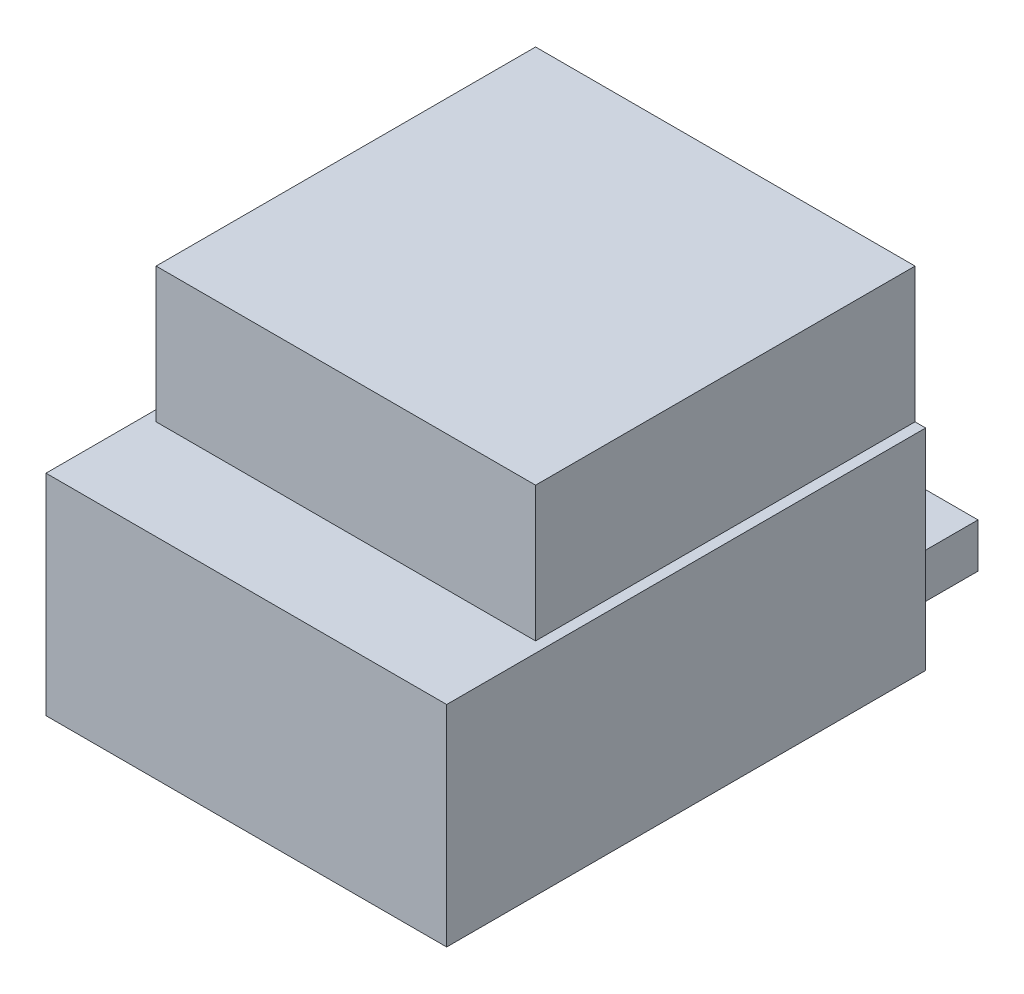
ISO-10303-21;
HEADER;
FILE_DESCRIPTION(('STEP AP214'),'2;1');
FILE_NAME('part.step','',(''),(''),'','','');
FILE_SCHEMA(('AUTOMOTIVE_DESIGN { 1 0 10303 214 1 1 1 1 }'));
ENDSEC;
DATA;
#1=APPLICATION_CONTEXT('core data for automotive mechanical design processes');
#2=APPLICATION_PROTOCOL_DEFINITION('international standard','automotive_design',2000,#1);
#3=PRODUCT_CONTEXT('',#1,'mechanical');
#4=PRODUCT('Part','Part','',(#3));
#5=PRODUCT_RELATED_PRODUCT_CATEGORY('part','',(#4));
#6=PRODUCT_DEFINITION_FORMATION('','',#4);
#7=PRODUCT_DEFINITION_CONTEXT('part definition',#1,'design');
#8=PRODUCT_DEFINITION('design','',#6,#7);
#9=PRODUCT_DEFINITION_SHAPE('','',#8);
#10=(LENGTH_UNIT() NAMED_UNIT(*) SI_UNIT(.MILLI.,.METRE.));
#11=(NAMED_UNIT(*) PLANE_ANGLE_UNIT() SI_UNIT($,.RADIAN.));
#12=(NAMED_UNIT(*) SI_UNIT($,.STERADIAN.) SOLID_ANGLE_UNIT());
#13=UNCERTAINTY_MEASURE_WITH_UNIT(LENGTH_MEASURE(1.E-05),#10,'distance_accuracy_value','');
#14=(GEOMETRIC_REPRESENTATION_CONTEXT(3) GLOBAL_UNCERTAINTY_ASSIGNED_CONTEXT((#13)) GLOBAL_UNIT_ASSIGNED_CONTEXT((#10,
#11,#12)) REPRESENTATION_CONTEXT('',''));
#15=CARTESIAN_POINT('',(0.,0.,0.));
#16=DIRECTION('',(0.,0.,1.));
#17=DIRECTION('',(1.,0.,0.));
#18=AXIS2_PLACEMENT_3D('',#15,#16,#17);
#19=CARTESIAN_POINT('',(-15.785,16.55,-18.87));
#20=DIRECTION('',(0.,0.,1.));
#21=DIRECTION('',(1.,0.,0.));
#22=AXIS2_PLACEMENT_3D('',#19,#20,#21);
#23=PLANE('',#22);
#24=DIRECTION('',(-1.,0.,0.));
#25=VECTOR('',#24,1.);
#26=CARTESIAN_POINT('',(-15.785,0.,-18.87));
#27=LINE('',#26,#25);
#28=CARTESIAN_POINT('',(15.785,0.,-18.87));
#29=VERTEX_POINT('',#28);
#30=CARTESIAN_POINT('',(-15.785,0.,-18.87));
#31=VERTEX_POINT('',#30);
#32=EDGE_CURVE('E222',#29,#31,#27,.T.);
#33=ORIENTED_EDGE('',*,*,#32,.T.);
#34=DIRECTION('',(0.,-1.,0.));
#35=VECTOR('',#34,1.);
#36=CARTESIAN_POINT('',(-15.785,16.55,-18.87));
#37=LINE('',#36,#35);
#38=CARTESIAN_POINT('',(-15.785,16.55,-18.87));
#39=VERTEX_POINT('',#38);
#40=EDGE_CURVE('E46',#39,#31,#37,.T.);
#41=ORIENTED_EDGE('',*,*,#40,.F.);
#42=DIRECTION('',(-1.,0.,0.));
#43=VECTOR('',#42,1.);
#44=CARTESIAN_POINT('',(-15.785,16.55,-18.87));
#45=LINE('',#44,#43);
#46=CARTESIAN_POINT('',(-14.95,16.55,-18.87));
#47=VERTEX_POINT('',#46);
#48=EDGE_CURVE('E205',#47,#39,#45,.T.);
#49=ORIENTED_EDGE('',*,*,#48,.F.);
#50=DIRECTION('',(0.,-1.,0.));
#51=VECTOR('',#50,1.);
#52=CARTESIAN_POINT('',(-14.95,27.18,-18.87));
#53=LINE('',#52,#51);
#54=CARTESIAN_POINT('',(-14.95,27.18,-18.87));
#55=VERTEX_POINT('',#54);
#56=EDGE_CURVE('E178',#55,#47,#53,.T.);
#57=ORIENTED_EDGE('',*,*,#56,.F.);
#58=DIRECTION('',(-1.,0.,0.));
#59=VECTOR('',#58,1.);
#60=CARTESIAN_POINT('',(14.95,27.18,-18.87));
#61=LINE('',#60,#59);
#62=CARTESIAN_POINT('',(14.95,27.18,-18.87));
#63=VERTEX_POINT('',#62);
#64=EDGE_CURVE('E176',#63,#55,#61,.T.);
#65=ORIENTED_EDGE('',*,*,#64,.F.);
#66=DIRECTION('',(0.,-1.,0.));
#67=VECTOR('',#66,1.);
#68=CARTESIAN_POINT('',(14.95,27.18,-18.87));
#69=LINE('',#68,#67);
#70=CARTESIAN_POINT('',(14.95,16.55,-18.87));
#71=VERTEX_POINT('',#70);
#72=EDGE_CURVE('E189',#63,#71,#69,.T.);
#73=ORIENTED_EDGE('',*,*,#72,.T.);
#74=CARTESIAN_POINT('',(15.785,16.55,-18.87));
#75=VERTEX_POINT('',#74);
#76=EDGE_CURVE('E208',#75,#71,#45,.T.);
#77=ORIENTED_EDGE('',*,*,#76,.F.);
#78=DIRECTION('',(0.,-1.,0.));
#79=VECTOR('',#78,1.);
#80=CARTESIAN_POINT('',(15.785,16.55,-18.87));
#81=LINE('',#80,#79);
#82=EDGE_CURVE('E11',#75,#29,#81,.T.);
#83=ORIENTED_EDGE('',*,*,#82,.T.);
#84=EDGE_LOOP('',(#33,#41,#49,#57,#65,#73,#77,#83));
#85=FACE_BOUND('',#84,.T.);
#86=DIRECTION('',(-1.,0.,0.));
#87=VECTOR('',#86,1.);
#88=CARTESIAN_POINT('',(13.07,5.5,-18.87));
#89=LINE('',#88,#87);
#90=CARTESIAN_POINT('',(13.07,5.5,-18.87));
#91=VERTEX_POINT('',#90);
#92=CARTESIAN_POINT('',(-13.07,5.5,-18.87));
#93=VERTEX_POINT('',#92);
#94=EDGE_CURVE('E139',#91,#93,#89,.T.);
#95=ORIENTED_EDGE('',*,*,#94,.T.);
#96=DIRECTION('',(0.,-1.,0.));
#97=VECTOR('',#96,1.);
#98=CARTESIAN_POINT('',(-13.07,5.5,-18.87));
#99=LINE('',#98,#97);
#100=CARTESIAN_POINT('',(-13.07,2.,-18.87));
#101=VERTEX_POINT('',#100);
#102=EDGE_CURVE('E152',#93,#101,#99,.T.);
#103=ORIENTED_EDGE('',*,*,#102,.T.);
#104=DIRECTION('',(-1.,0.,0.));
#105=VECTOR('',#104,1.);
#106=CARTESIAN_POINT('',(13.07,2.,-18.87));
#107=LINE('',#106,#105);
#108=CARTESIAN_POINT('',(13.07,2.,-18.87));
#109=VERTEX_POINT('',#108);
#110=EDGE_CURVE('E153',#109,#101,#107,.T.);
#111=ORIENTED_EDGE('',*,*,#110,.F.);
#112=DIRECTION('',(0.,-1.,0.));
#113=VECTOR('',#112,1.);
#114=CARTESIAN_POINT('',(13.07,5.5,-18.87));
#115=LINE('',#114,#113);
#116=EDGE_CURVE('E165',#91,#109,#115,.T.);
#117=ORIENTED_EDGE('',*,*,#116,.F.);
#118=EDGE_LOOP('',(#95,#103,#111,#117));
#119=FACE_BOUND('',#118,.T.);
#120=ADVANCED_FACE('F37',(#85,#119),#23,.F.);
#121=CARTESIAN_POINT('',(0.,16.55,0.));
#122=DIRECTION('',(0.,-1.,0.));
#123=DIRECTION('',(0.,0.,-1.));
#124=AXIS2_PLACEMENT_3D('',#121,#122,#123);
#125=PLANE('',#124);
#126=DIRECTION('',(0.,0.,1.));
#127=VECTOR('',#126,1.);
#128=CARTESIAN_POINT('',(-14.95,16.55,11.03));
#129=LINE('',#128,#127);
#130=CARTESIAN_POINT('',(-14.95,16.55,11.03));
#131=VERTEX_POINT('',#130);
#132=EDGE_CURVE('E164',#47,#131,#129,.T.);
#133=ORIENTED_EDGE('',*,*,#132,.F.);
#134=ORIENTED_EDGE('',*,*,#48,.T.);
#135=DIRECTION('',(0.,0.,1.));
#136=VECTOR('',#135,1.);
#137=CARTESIAN_POINT('',(-15.785,16.55,18.87));
#138=LINE('',#137,#136);
#139=CARTESIAN_POINT('',(-15.785,16.55,18.87));
#140=VERTEX_POINT('',#139);
#141=EDGE_CURVE('E213',#39,#140,#138,.T.);
#142=ORIENTED_EDGE('',*,*,#141,.T.);
#143=DIRECTION('',(1.,0.,0.));
#144=VECTOR('',#143,1.);
#145=CARTESIAN_POINT('',(-15.785,16.55,18.87));
#146=LINE('',#145,#144);
#147=CARTESIAN_POINT('',(15.785,16.55,18.87));
#148=VERTEX_POINT('',#147);
#149=EDGE_CURVE('E216',#140,#148,#146,.T.);
#150=ORIENTED_EDGE('',*,*,#149,.T.);
#151=DIRECTION('',(0.,0.,-1.));
#152=VECTOR('',#151,1.);
#153=CARTESIAN_POINT('',(15.785,16.55,18.87));
#154=LINE('',#153,#152);
#155=EDGE_CURVE('E209',#148,#75,#154,.T.);
#156=ORIENTED_EDGE('',*,*,#155,.T.);
#157=ORIENTED_EDGE('',*,*,#76,.T.);
#158=DIRECTION('',(0.,0.,-1.));
#159=VECTOR('',#158,1.);
#160=CARTESIAN_POINT('',(14.95,16.55,11.03));
#161=LINE('',#160,#159);
#162=CARTESIAN_POINT('',(14.95,16.55,11.03));
#163=VERTEX_POINT('',#162);
#164=EDGE_CURVE('E172',#163,#71,#161,.T.);
#165=ORIENTED_EDGE('',*,*,#164,.F.);
#166=DIRECTION('',(1.,0.,0.));
#167=VECTOR('',#166,1.);
#168=CARTESIAN_POINT('',(14.95,16.55,11.03));
#169=LINE('',#168,#167);
#170=EDGE_CURVE('E62',#131,#163,#169,.T.);
#171=ORIENTED_EDGE('',*,*,#170,.F.);
#172=EDGE_LOOP('',(#133,#134,#142,#150,#156,#157,#165,#171));
#173=FACE_BOUND('',#172,.T.);
#174=ADVANCED_FACE('F253',(#173),#125,.F.);
#175=CARTESIAN_POINT('',(15.785,16.55,18.87));
#176=DIRECTION('',(-1.,0.,0.));
#177=DIRECTION('',(0.,0.,1.));
#178=AXIS2_PLACEMENT_3D('',#175,#176,#177);
#179=PLANE('',#178);
#180=DIRECTION('',(0.,0.,-1.));
#181=VECTOR('',#180,1.);
#182=CARTESIAN_POINT('',(15.785,0.,18.87));
#183=LINE('',#182,#181);
#184=CARTESIAN_POINT('',(15.785,0.,18.87));
#185=VERTEX_POINT('',#184);
#186=EDGE_CURVE('E219',#185,#29,#183,.T.);
#187=ORIENTED_EDGE('',*,*,#186,.T.);
#188=ORIENTED_EDGE('',*,*,#82,.F.);
#189=ORIENTED_EDGE('',*,*,#155,.F.);
#190=DIRECTION('',(0.,-1.,0.));
#191=VECTOR('',#190,1.);
#192=CARTESIAN_POINT('',(15.785,16.55,18.87));
#193=LINE('',#192,#191);
#194=EDGE_CURVE('E218',#148,#185,#193,.T.);
#195=ORIENTED_EDGE('',*,*,#194,.T.);
#196=EDGE_LOOP('',(#187,#188,#189,#195));
#197=FACE_BOUND('',#196,.T.);
#198=ADVANCED_FACE('F39',(#197),#179,.F.);
#199=CARTESIAN_POINT('',(-15.785,16.55,18.87));
#200=DIRECTION('',(1.,0.,0.));
#201=DIRECTION('',(0.,0.,-1.));
#202=AXIS2_PLACEMENT_3D('',#199,#200,#201);
#203=PLANE('',#202);
#204=DIRECTION('',(0.,0.,1.));
#205=VECTOR('',#204,1.);
#206=CARTESIAN_POINT('',(-15.785,0.,18.87));
#207=LINE('',#206,#205);
#208=CARTESIAN_POINT('',(-15.785,0.,18.87));
#209=VERTEX_POINT('',#208);
#210=EDGE_CURVE('E224',#31,#209,#207,.T.);
#211=ORIENTED_EDGE('',*,*,#210,.T.);
#212=DIRECTION('',(0.,-1.,0.));
#213=VECTOR('',#212,1.);
#214=CARTESIAN_POINT('',(-15.785,16.55,18.87));
#215=LINE('',#214,#213);
#216=EDGE_CURVE('E230',#140,#209,#215,.T.);
#217=ORIENTED_EDGE('',*,*,#216,.F.);
#218=ORIENTED_EDGE('',*,*,#141,.F.);
#219=ORIENTED_EDGE('',*,*,#40,.T.);
#220=EDGE_LOOP('',(#211,#217,#218,#219));
#221=FACE_BOUND('',#220,.T.);
#222=ADVANCED_FACE('F238',(#221),#203,.F.);
#223=CARTESIAN_POINT('',(-15.785,16.55,18.87));
#224=DIRECTION('',(0.,0.,-1.));
#225=DIRECTION('',(-1.,0.,0.));
#226=AXIS2_PLACEMENT_3D('',#223,#224,#225);
#227=PLANE('',#226);
#228=DIRECTION('',(1.,0.,0.));
#229=VECTOR('',#228,1.);
#230=CARTESIAN_POINT('',(-15.785,0.,18.87));
#231=LINE('',#230,#229);
#232=EDGE_CURVE('E226',#209,#185,#231,.T.);
#233=ORIENTED_EDGE('',*,*,#232,.T.);
#234=ORIENTED_EDGE('',*,*,#194,.F.);
#235=ORIENTED_EDGE('',*,*,#149,.F.);
#236=ORIENTED_EDGE('',*,*,#216,.T.);
#237=EDGE_LOOP('',(#233,#234,#235,#236));
#238=FACE_BOUND('',#237,.T.);
#239=ADVANCED_FACE('F247',(#238),#227,.F.);
#240=CARTESIAN_POINT('',(0.,0.,0.));
#241=DIRECTION('',(0.,-1.,0.));
#242=DIRECTION('',(0.,0.,-1.));
#243=AXIS2_PLACEMENT_3D('',#240,#241,#242);
#244=PLANE('',#243);
#245=ORIENTED_EDGE('',*,*,#186,.F.);
#246=ORIENTED_EDGE('',*,*,#232,.F.);
#247=ORIENTED_EDGE('',*,*,#210,.F.);
#248=ORIENTED_EDGE('',*,*,#32,.F.);
#249=EDGE_LOOP('',(#245,#246,#247,#248));
#250=FACE_BOUND('',#249,.T.);
#251=ADVANCED_FACE('F244',(#250),#244,.T.);
#252=CARTESIAN_POINT('',(-14.95,27.18,11.03));
#253=DIRECTION('',(1.,0.,0.));
#254=DIRECTION('',(0.,0.,-1.));
#255=AXIS2_PLACEMENT_3D('',#252,#253,#254);
#256=PLANE('',#255);
#257=ORIENTED_EDGE('',*,*,#132,.T.);
#258=DIRECTION('',(0.,-1.,0.));
#259=VECTOR('',#258,1.);
#260=CARTESIAN_POINT('',(-14.95,27.18,11.03));
#261=LINE('',#260,#259);
#262=CARTESIAN_POINT('',(-14.95,27.18,11.03));
#263=VERTEX_POINT('',#262);
#264=EDGE_CURVE('E195',#263,#131,#261,.T.);
#265=ORIENTED_EDGE('',*,*,#264,.F.);
#266=DIRECTION('',(0.,0.,1.));
#267=VECTOR('',#266,1.);
#268=CARTESIAN_POINT('',(-14.95,27.18,11.03));
#269=LINE('',#268,#267);
#270=EDGE_CURVE('E168',#55,#263,#269,.T.);
#271=ORIENTED_EDGE('',*,*,#270,.F.);
#272=ORIENTED_EDGE('',*,*,#56,.T.);
#273=EDGE_LOOP('',(#257,#265,#271,#272));
#274=FACE_BOUND('',#273,.T.);
#275=ADVANCED_FACE('F256',(#274),#256,.F.);
#276=CARTESIAN_POINT('',(14.95,27.18,11.03));
#277=DIRECTION('',(0.,0.,-1.));
#278=DIRECTION('',(-1.,0.,0.));
#279=AXIS2_PLACEMENT_3D('',#276,#277,#278);
#280=PLANE('',#279);
#281=ORIENTED_EDGE('',*,*,#170,.T.);
#282=DIRECTION('',(0.,-1.,0.));
#283=VECTOR('',#282,1.);
#284=CARTESIAN_POINT('',(14.95,27.18,11.03));
#285=LINE('',#284,#283);
#286=CARTESIAN_POINT('',(14.95,27.18,11.03));
#287=VERTEX_POINT('',#286);
#288=EDGE_CURVE('E182',#287,#163,#285,.T.);
#289=ORIENTED_EDGE('',*,*,#288,.F.);
#290=DIRECTION('',(1.,0.,0.));
#291=VECTOR('',#290,1.);
#292=CARTESIAN_POINT('',(14.95,27.18,11.03));
#293=LINE('',#292,#291);
#294=EDGE_CURVE('E171',#263,#287,#293,.T.);
#295=ORIENTED_EDGE('',*,*,#294,.F.);
#296=ORIENTED_EDGE('',*,*,#264,.T.);
#297=EDGE_LOOP('',(#281,#289,#295,#296));
#298=FACE_BOUND('',#297,.T.);
#299=ADVANCED_FACE('F264',(#298),#280,.F.);
#300=CARTESIAN_POINT('',(14.95,27.18,11.03));
#301=DIRECTION('',(-1.,0.,0.));
#302=DIRECTION('',(0.,0.,1.));
#303=AXIS2_PLACEMENT_3D('',#300,#301,#302);
#304=PLANE('',#303);
#305=ORIENTED_EDGE('',*,*,#164,.T.);
#306=ORIENTED_EDGE('',*,*,#72,.F.);
#307=DIRECTION('',(0.,0.,-1.));
#308=VECTOR('',#307,1.);
#309=CARTESIAN_POINT('',(14.95,27.18,11.03));
#310=LINE('',#309,#308);
#311=EDGE_CURVE('E174',#287,#63,#310,.T.);
#312=ORIENTED_EDGE('',*,*,#311,.F.);
#313=ORIENTED_EDGE('',*,*,#288,.T.);
#314=EDGE_LOOP('',(#305,#306,#312,#313));
#315=FACE_BOUND('',#314,.T.);
#316=ADVANCED_FACE('F262',(#315),#304,.F.);
#317=CARTESIAN_POINT('',(0.,27.18,0.));
#318=DIRECTION('',(0.,1.,0.));
#319=DIRECTION('',(0.,0.,1.));
#320=AXIS2_PLACEMENT_3D('',#317,#318,#319);
#321=PLANE('',#320);
#322=ORIENTED_EDGE('',*,*,#270,.T.);
#323=ORIENTED_EDGE('',*,*,#294,.T.);
#324=ORIENTED_EDGE('',*,*,#311,.T.);
#325=ORIENTED_EDGE('',*,*,#64,.T.);
#326=EDGE_LOOP('',(#322,#323,#324,#325));
#327=FACE_BOUND('',#326,.T.);
#328=ADVANCED_FACE('F258',(#327),#321,.T.);
#329=CARTESIAN_POINT('',(-13.07,5.5,-25.71));
#330=DIRECTION('',(-1.,0.,0.));
#331=DIRECTION('',(0.,0.,1.));
#332=AXIS2_PLACEMENT_3D('',#329,#330,#331);
#333=PLANE('',#332);
#334=DIRECTION('',(0.,0.,-1.));
#335=VECTOR('',#334,1.);
#336=CARTESIAN_POINT('',(-13.07,2.,-25.71));
#337=LINE('',#336,#335);
#338=CARTESIAN_POINT('',(-13.07,2.,-25.71));
#339=VERTEX_POINT('',#338);
#340=EDGE_CURVE('E159',#101,#339,#337,.T.);
#341=ORIENTED_EDGE('',*,*,#340,.F.);
#342=ORIENTED_EDGE('',*,*,#102,.F.);
#343=DIRECTION('',(0.,0.,-1.));
#344=VECTOR('',#343,1.);
#345=CARTESIAN_POINT('',(-13.07,5.5,-25.71));
#346=LINE('',#345,#344);
#347=CARTESIAN_POINT('',(-13.07,5.5,-25.71));
#348=VERTEX_POINT('',#347);
#349=EDGE_CURVE('E146',#93,#348,#346,.T.);
#350=ORIENTED_EDGE('',*,*,#349,.T.);
#351=DIRECTION('',(0.,-1.,0.));
#352=VECTOR('',#351,1.);
#353=CARTESIAN_POINT('',(-13.07,5.5,-25.71));
#354=LINE('',#353,#352);
#355=EDGE_CURVE('E130',#348,#339,#354,.T.);
#356=ORIENTED_EDGE('',*,*,#355,.T.);
#357=EDGE_LOOP('',(#341,#342,#350,#356));
#358=FACE_BOUND('',#357,.T.);
#359=ADVANCED_FACE('F150',(#358),#333,.T.);
#360=CARTESIAN_POINT('',(13.07,5.5,-25.71));
#361=DIRECTION('',(1.,0.,0.));
#362=DIRECTION('',(0.,0.,-1.));
#363=AXIS2_PLACEMENT_3D('',#360,#361,#362);
#364=PLANE('',#363);
#365=DIRECTION('',(0.,0.,1.));
#366=VECTOR('',#365,1.);
#367=CARTESIAN_POINT('',(13.07,2.,-25.71));
#368=LINE('',#367,#366);
#369=CARTESIAN_POINT('',(13.07,2.,-25.71));
#370=VERTEX_POINT('',#369);
#371=EDGE_CURVE('E54',#370,#109,#368,.T.);
#372=ORIENTED_EDGE('',*,*,#371,.F.);
#373=DIRECTION('',(0.,-1.,0.));
#374=VECTOR('',#373,1.);
#375=CARTESIAN_POINT('',(13.07,5.5,-25.71));
#376=LINE('',#375,#374);
#377=CARTESIAN_POINT('',(13.07,5.5,-25.71));
#378=VERTEX_POINT('',#377);
#379=EDGE_CURVE('E138',#378,#370,#376,.T.);
#380=ORIENTED_EDGE('',*,*,#379,.F.);
#381=DIRECTION('',(0.,0.,1.));
#382=VECTOR('',#381,1.);
#383=CARTESIAN_POINT('',(13.07,5.5,-25.71));
#384=LINE('',#383,#382);
#385=EDGE_CURVE('E148',#378,#91,#384,.T.);
#386=ORIENTED_EDGE('',*,*,#385,.T.);
#387=ORIENTED_EDGE('',*,*,#116,.T.);
#388=EDGE_LOOP('',(#372,#380,#386,#387));
#389=FACE_BOUND('',#388,.T.);
#390=ADVANCED_FACE('F327',(#389),#364,.T.);
#391=CARTESIAN_POINT('',(13.07,5.5,-25.71));
#392=DIRECTION('',(0.,0.,-1.));
#393=DIRECTION('',(-1.,0.,0.));
#394=AXIS2_PLACEMENT_3D('',#391,#392,#393);
#395=PLANE('',#394);
#396=DIRECTION('',(1.,0.,0.));
#397=VECTOR('',#396,1.);
#398=CARTESIAN_POINT('',(13.07,2.,-25.71));
#399=LINE('',#398,#397);
#400=EDGE_CURVE('E134',#339,#370,#399,.T.);
#401=ORIENTED_EDGE('',*,*,#400,.F.);
#402=ORIENTED_EDGE('',*,*,#355,.F.);
#403=DIRECTION('',(1.,0.,0.));
#404=VECTOR('',#403,1.);
#405=CARTESIAN_POINT('',(13.07,5.5,-25.71));
#406=LINE('',#405,#404);
#407=EDGE_CURVE('E133',#348,#378,#406,.T.);
#408=ORIENTED_EDGE('',*,*,#407,.T.);
#409=ORIENTED_EDGE('',*,*,#379,.T.);
#410=EDGE_LOOP('',(#401,#402,#408,#409));
#411=FACE_BOUND('',#410,.T.);
#412=ADVANCED_FACE('F132',(#411),#395,.T.);
#413=CARTESIAN_POINT('',(0.,5.5,0.));
#414=DIRECTION('',(0.,-1.,0.));
#415=DIRECTION('',(0.,0.,-1.));
#416=AXIS2_PLACEMENT_3D('',#413,#414,#415);
#417=PLANE('',#416);
#418=ORIENTED_EDGE('',*,*,#349,.F.);
#419=ORIENTED_EDGE('',*,*,#94,.F.);
#420=ORIENTED_EDGE('',*,*,#385,.F.);
#421=ORIENTED_EDGE('',*,*,#407,.F.);
#422=EDGE_LOOP('',(#418,#419,#420,#421));
#423=FACE_BOUND('',#422,.T.);
#424=ADVANCED_FACE('F144',(#423),#417,.F.);
#425=CARTESIAN_POINT('',(0.,2.,0.));
#426=DIRECTION('',(0.,-1.,0.));
#427=DIRECTION('',(0.,0.,-1.));
#428=AXIS2_PLACEMENT_3D('',#425,#426,#427);
#429=PLANE('',#428);
#430=ORIENTED_EDGE('',*,*,#340,.T.);
#431=ORIENTED_EDGE('',*,*,#400,.T.);
#432=ORIENTED_EDGE('',*,*,#371,.T.);
#433=ORIENTED_EDGE('',*,*,#110,.T.);
#434=EDGE_LOOP('',(#430,#431,#432,#433));
#435=FACE_BOUND('',#434,.T.);
#436=ADVANCED_FACE('F353',(#435),#429,.T.);
#437=CLOSED_SHELL('',(#120,#174,#198,#222,#239,#251,#275,#299,#316,#328,#359,#390,#412,#424,#436));
#438=MANIFOLD_SOLID_BREP('B2',#437);
#439=ADVANCED_BREP_SHAPE_REPRESENTATION('',(#18,#438),#14);
#440=SHAPE_DEFINITION_REPRESENTATION(#9,#439);
ENDSEC;
END-ISO-10303-21;
